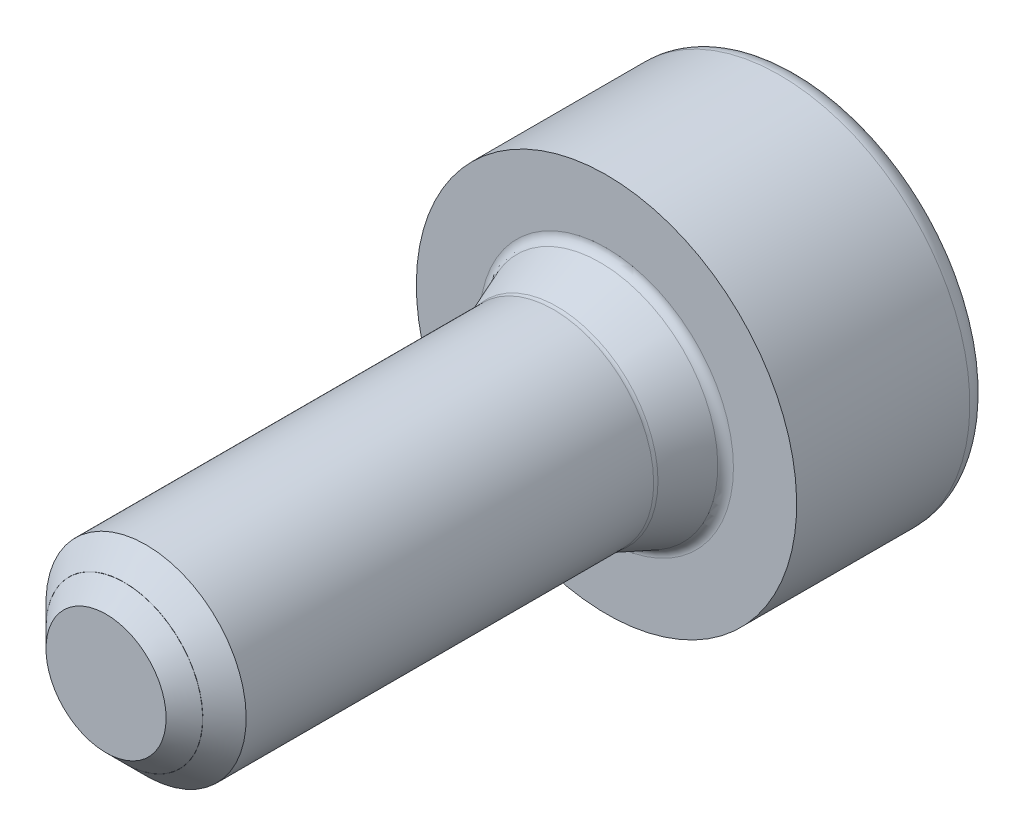
ISO-10303-21;
HEADER;
FILE_DESCRIPTION(('STEP AP214'),'2;1');
FILE_NAME('part.step','',(''),(''),'','','');
FILE_SCHEMA(('AUTOMOTIVE_DESIGN { 1 0 10303 214 1 1 1 1 }'));
ENDSEC;
DATA;
#1=APPLICATION_CONTEXT('core data for automotive mechanical design processes');
#2=APPLICATION_PROTOCOL_DEFINITION('international standard','automotive_design',2000,#1);
#3=PRODUCT_CONTEXT('',#1,'mechanical');
#4=PRODUCT('Part','Part','',(#3));
#5=PRODUCT_RELATED_PRODUCT_CATEGORY('part','',(#4));
#6=PRODUCT_DEFINITION_FORMATION('','',#4);
#7=PRODUCT_DEFINITION_CONTEXT('part definition',#1,'design');
#8=PRODUCT_DEFINITION('design','',#6,#7);
#9=PRODUCT_DEFINITION_SHAPE('','',#8);
#10=(LENGTH_UNIT() NAMED_UNIT(*) SI_UNIT(.MILLI.,.METRE.));
#11=(NAMED_UNIT(*) PLANE_ANGLE_UNIT() SI_UNIT($,.RADIAN.));
#12=(NAMED_UNIT(*) SI_UNIT($,.STERADIAN.) SOLID_ANGLE_UNIT());
#13=UNCERTAINTY_MEASURE_WITH_UNIT(LENGTH_MEASURE(1.E-05),#10,'distance_accuracy_value','');
#14=(GEOMETRIC_REPRESENTATION_CONTEXT(3) GLOBAL_UNCERTAINTY_ASSIGNED_CONTEXT((#13)) GLOBAL_UNIT_ASSIGNED_CONTEXT((#10,
#11,#12)) REPRESENTATION_CONTEXT('',''));
#15=CARTESIAN_POINT('',(0.,0.,0.));
#16=DIRECTION('',(0.,0.,1.));
#17=DIRECTION('',(1.,0.,0.));
#18=AXIS2_PLACEMENT_3D('',#15,#16,#17);
#19=CARTESIAN_POINT('',(-5.5,8.176279441629,11.78794470637));
#20=DIRECTION('',(0.,0.,-1.));
#21=DIRECTION('',(0.500000000000017,-0.866025403784429,0.));
#22=AXIS2_PLACEMENT_3D('',#19,#20,#21);
#23=CONICAL_SURFACE('',#22,1.091002075935,0.373726819965523);
#24=CARTESIAN_POINT('',(-5.5,8.176279441629,11.57349124712));
#25=DIRECTION('',(0.,0.,-1.));
#26=DIRECTION('',(0.500000000000017,-0.866025403784429,0.));
#27=AXIS2_PLACEMENT_3D('',#24,#25,#26);
#28=CIRCLE('',#27,1.175101471718);
#29=CARTESIAN_POINT('',(-4.91244926414098,7.15861171509674,11.57349124712));
#30=VERTEX_POINT('',#29);
#31=EDGE_CURVE('E32',#30,#30,#28,.T.);
#32=ORIENTED_EDGE('',*,*,#31,.F.);
#33=EDGE_LOOP('',(#32));
#34=FACE_BOUND('',#33,.T.);
#35=CARTESIAN_POINT('',(-5.5,8.176279441629,12.00239816561));
#36=DIRECTION('',(0.,0.,1.));
#37=DIRECTION('',(-0.500000000000017,0.866025403784429,0.));
#38=AXIS2_PLACEMENT_3D('',#35,#36,#37);
#39=CIRCLE('',#38,1.006902680151);
#40=CARTESIAN_POINT('',(-6.00345134007552,9.04828274177839,12.00239816561));
#41=VERTEX_POINT('',#40);
#42=EDGE_CURVE('E11',#41,#41,#39,.T.);
#43=ORIENTED_EDGE('',*,*,#42,.F.);
#44=EDGE_LOOP('',(#43));
#45=FACE_BOUND('',#44,.T.);
#46=ADVANCED_FACE('F16',(#34,#45),#23,.T.);
#47=CARTESIAN_POINT('',(-5.5,8.176279441629,12.0389069185));
#48=DIRECTION('',(0.,0.,-1.));
#49=DIRECTION('',(0.500000000000017,-0.866025403784429,0.));
#50=AXIS2_PLACEMENT_3D('',#47,#48,#49);
#51=TOROIDAL_SURFACE('',#50,1.1,0.1);
#52=CARTESIAN_POINT('',(-5.5,8.176279441629,12.0389069185));
#53=DIRECTION('',(0.,0.,-1.));
#54=DIRECTION('',(0.500000000000017,-0.866025403784429,0.));
#55=AXIS2_PLACEMENT_3D('',#52,#53,#54);
#56=CIRCLE('',#55,1.);
#57=CARTESIAN_POINT('',(-4.99999999999998,7.31025403784457,12.0389069185));
#58=VERTEX_POINT('',#57);
#59=EDGE_CURVE('E133',#58,#58,#56,.T.);
#60=ORIENTED_EDGE('',*,*,#59,.T.);
#61=EDGE_LOOP('',(#60));
#62=FACE_BOUND('',#61,.T.);
#63=ORIENTED_EDGE('',*,*,#42,.T.);
#64=EDGE_LOOP('',(#63));
#65=FACE_BOUND('',#64,.T.);
#66=ADVANCED_FACE('F278',(#62,#65),#51,.F.);
#67=CARTESIAN_POINT('',(-5.5,8.176279441629,11.61));
#68=DIRECTION('',(0.,0.,1.));
#69=DIRECTION('',(-0.500000000000017,0.866025403784429,0.));
#70=AXIS2_PLACEMENT_3D('',#67,#68,#69);
#71=TOROIDAL_SURFACE('',#70,1.268198791567,0.1);
#72=CARTESIAN_POINT('',(-5.5,8.176279441629,11.51));
#73=DIRECTION('',(0.,0.,-1.));
#74=DIRECTION('',(-0.500000000000017,0.866025403784429,0.));
#75=AXIS2_PLACEMENT_3D('',#72,#73,#74);
#76=CIRCLE('',#75,1.268198791567);
#77=CARTESIAN_POINT('',(-6.13409939578352,9.27457181217474,11.51));
#78=VERTEX_POINT('',#77);
#79=EDGE_CURVE('E160',#78,#78,#76,.T.);
#80=ORIENTED_EDGE('',*,*,#79,.F.);
#81=EDGE_LOOP('',(#80));
#82=FACE_BOUND('',#81,.T.);
#83=ORIENTED_EDGE('',*,*,#31,.T.);
#84=EDGE_LOOP('',(#83));
#85=FACE_BOUND('',#84,.T.);
#86=ADVANCED_FACE('F283',(#82,#85),#71,.F.);
#87=CARTESIAN_POINT('',(-5.5,8.176279441629,11.51));
#88=DIRECTION('',(0.,0.,1.));
#89=DIRECTION('',(1.,0.,0.));
#90=AXIS2_PLACEMENT_3D('',#87,#88,#89);
#91=PLANE('',#90);
#92=CARTESIAN_POINT('',(-5.5,8.176279441629,11.51));
#93=DIRECTION('',(0.,0.,1.));
#94=DIRECTION('',(-0.500000000000017,0.866025403784429,0.));
#95=AXIS2_PLACEMENT_3D('',#92,#93,#94);
#96=CIRCLE('',#95,1.9);
#97=CARTESIAN_POINT('',(-6.45000000000003,9.82172770881941,11.51));
#98=VERTEX_POINT('',#97);
#99=EDGE_CURVE('E155',#98,#98,#96,.T.);
#100=ORIENTED_EDGE('',*,*,#99,.T.);
#101=EDGE_LOOP('',(#100));
#102=FACE_BOUND('',#101,.T.);
#103=ORIENTED_EDGE('',*,*,#79,.T.);
#104=EDGE_LOOP('',(#103));
#105=FACE_BOUND('',#104,.T.);
#106=ADVANCED_FACE('F290',(#102,#105),#91,.T.);
#107=CARTESIAN_POINT('',(-5.5,8.176279441629,9.58));
#108=DIRECTION('',(0.,0.,1.));
#109=DIRECTION('',(-0.500000000000017,0.866025403784429,0.));
#110=AXIS2_PLACEMENT_3D('',#107,#108,#109);
#111=CYLINDRICAL_SURFACE('',#110,1.9);
#112=ORIENTED_EDGE('',*,*,#99,.F.);
#113=EDGE_LOOP('',(#112));
#114=FACE_BOUND('',#113,.T.);
#115=CARTESIAN_POINT('',(-5.5,8.176279441629,9.78));
#116=DIRECTION('',(0.,0.,-1.));
#117=DIRECTION('',(-0.500000000000017,0.866025403784429,0.));
#118=AXIS2_PLACEMENT_3D('',#115,#116,#117);
#119=CIRCLE('',#118,1.9);
#120=CARTESIAN_POINT('',(-6.45000000000003,9.82172770881941,9.78));
#121=VERTEX_POINT('',#120);
#122=EDGE_CURVE('E151',#121,#121,#119,.T.);
#123=ORIENTED_EDGE('',*,*,#122,.F.);
#124=EDGE_LOOP('',(#123));
#125=FACE_BOUND('',#124,.T.);
#126=ADVANCED_FACE('F296',(#114,#125),#111,.T.);
#127=CARTESIAN_POINT('',(-5.5,8.176279441629,9.78));
#128=DIRECTION('',(0.,0.,-1.));
#129=DIRECTION('',(0.500000000000017,-0.866025403784429,0.));
#130=AXIS2_PLACEMENT_3D('',#127,#128,#129);
#131=TOROIDAL_SURFACE('',#130,1.7,0.2);
#132=CARTESIAN_POINT('',(-5.5,8.176279441629,9.58));
#133=DIRECTION('',(0.,0.,-1.));
#134=DIRECTION('',(0.500000000000017,-0.866025403784429,0.));
#135=AXIS2_PLACEMENT_3D('',#132,#133,#134);
#136=CIRCLE('',#135,1.7);
#137=CARTESIAN_POINT('',(-4.64999999999997,6.70403625519547,9.58));
#138=VERTEX_POINT('',#137);
#139=EDGE_CURVE('E156',#138,#138,#136,.T.);
#140=ORIENTED_EDGE('',*,*,#139,.F.);
#141=EDGE_LOOP('',(#140));
#142=FACE_BOUND('',#141,.T.);
#143=ORIENTED_EDGE('',*,*,#122,.T.);
#144=EDGE_LOOP('',(#143));
#145=FACE_BOUND('',#144,.T.);
#146=ADVANCED_FACE('F301',(#142,#145),#131,.T.);
#147=CARTESIAN_POINT('',(-5.5,8.176279441629,9.58));
#148=DIRECTION('',(0.,0.,-1.));
#149=DIRECTION('',(0.,-1.,0.));
#150=AXIS2_PLACEMENT_3D('',#147,#148,#149);
#151=PLANE('',#150);
#152=ORIENTED_EDGE('',*,*,#139,.T.);
#153=EDGE_LOOP('',(#152));
#154=FACE_BOUND('',#153,.T.);
#155=DIRECTION('',(-0.866025403784429,0.500000000000017,0.));
#156=VECTOR('',#155,1.);
#157=CARTESIAN_POINT('',(-4.75,8.609292143521,9.58));
#158=LINE('',#157,#156);
#159=CARTESIAN_POINT('',(-4.75,8.609292143521,9.58));
#160=VERTEX_POINT('',#159);
#161=CARTESIAN_POINT('',(-5.5,9.042304845413,9.58));
#162=VERTEX_POINT('',#161);
#163=EDGE_CURVE('E173',#160,#162,#158,.T.);
#164=ORIENTED_EDGE('',*,*,#163,.T.);
#165=DIRECTION('',(0.866025403784429,0.500000000000017,0.));
#166=VECTOR('',#165,1.);
#167=CARTESIAN_POINT('',(-6.25,8.609292143521,9.58));
#168=LINE('',#167,#166);
#169=CARTESIAN_POINT('',(-6.25,8.609292143521,9.58));
#170=VERTEX_POINT('',#169);
#171=EDGE_CURVE('E116',#170,#162,#168,.T.);
#172=ORIENTED_EDGE('',*,*,#171,.F.);
#173=DIRECTION('',(0.,-1.,0.));
#174=VECTOR('',#173,1.);
#175=CARTESIAN_POINT('',(-6.25,8.609292143521,9.58));
#176=LINE('',#175,#174);
#177=CARTESIAN_POINT('',(-6.25,7.743266739737,9.58));
#178=VERTEX_POINT('',#177);
#179=EDGE_CURVE('E112',#170,#178,#176,.T.);
#180=ORIENTED_EDGE('',*,*,#179,.T.);
#181=DIRECTION('',(0.866025403784429,-0.500000000000017,0.));
#182=VECTOR('',#181,1.);
#183=CARTESIAN_POINT('',(-6.25,7.743266739737,9.58));
#184=LINE('',#183,#182);
#185=CARTESIAN_POINT('',(-5.5,7.310254037844,9.58));
#186=VERTEX_POINT('',#185);
#187=EDGE_CURVE('E169',#178,#186,#184,.T.);
#188=ORIENTED_EDGE('',*,*,#187,.T.);
#189=DIRECTION('',(-0.866025403784429,-0.500000000000017,0.));
#190=VECTOR('',#189,1.);
#191=CARTESIAN_POINT('',(-4.75,7.743266739737,9.58));
#192=LINE('',#191,#190);
#193=CARTESIAN_POINT('',(-4.75,7.743266739737,9.58));
#194=VERTEX_POINT('',#193);
#195=EDGE_CURVE('E164',#194,#186,#192,.T.);
#196=ORIENTED_EDGE('',*,*,#195,.F.);
#197=DIRECTION('',(0.,1.,0.));
#198=VECTOR('',#197,1.);
#199=CARTESIAN_POINT('',(-4.75,7.743266739737,9.58));
#200=LINE('',#199,#198);
#201=EDGE_CURVE('E46',#194,#160,#200,.T.);
#202=ORIENTED_EDGE('',*,*,#201,.T.);
#203=EDGE_LOOP('',(#164,#172,#180,#188,#196,#202));
#204=FACE_BOUND('',#203,.T.);
#205=ADVANCED_FACE('F304',(#154,#204),#151,.T.);
#206=CARTESIAN_POINT('',(-4.75,8.176279441629,10.33));
#207=DIRECTION('',(1.,0.,0.));
#208=DIRECTION('',(0.,1.,0.));
#209=AXIS2_PLACEMENT_3D('',#206,#207,#208);
#210=PLANE('',#209);
#211=ORIENTED_EDGE('',*,*,#201,.F.);
#212=DIRECTION('',(0.,0.,-1.));
#213=VECTOR('',#212,1.);
#214=CARTESIAN_POINT('',(-4.75,7.743266739737,10.57998533269));
#215=LINE('',#214,#213);
#216=CARTESIAN_POINT('',(-4.75000000000012,7.74326673973699,10.5799853326872));
#217=VERTEX_POINT('',#216);
#218=EDGE_CURVE('E172',#217,#194,#215,.T.);
#219=ORIENTED_EDGE('',*,*,#218,.F.);
#220=CARTESIAN_POINT('',(-4.75,8.60929214352109,10.5799853326871));
#221=CARTESIAN_POINT('',(-4.75,8.57123547365222,10.5909748550173));
#222=CARTESIAN_POINT('',(-4.75,8.53285027963346,10.6009692526385));
#223=CARTESIAN_POINT('',(-4.75,8.45541523688286,10.6184141692236));
#224=CARTESIAN_POINT('',(-4.75,8.41636401254825,10.6258585170532));
#225=CARTESIAN_POINT('',(-4.75,8.3387455349859,10.6374461530633));
#226=CARTESIAN_POINT('',(-4.75,8.30019022242791,10.6416665775635));
#227=CARTESIAN_POINT('',(-4.75,8.22289826861885,10.6467039041215));
#228=CARTESIAN_POINT('',(-4.75,8.18416190814528,10.647524978911));
#229=CARTESIAN_POINT('',(-4.75,8.11178742223541,10.6458123276901));
#230=CARTESIAN_POINT('',(-4.75,8.07813843465588,10.6436991136606));
#231=CARTESIAN_POINT('',(-4.75,8.01105968520212,10.6370028771495));
#232=CARTESIAN_POINT('',(-4.75,7.97763015519125,10.6324175693746));
#233=CARTESIAN_POINT('',(-4.75,7.91041321187103,10.6209552091911));
#234=CARTESIAN_POINT('',(-4.75,7.87663430240448,10.6140295891455));
#235=CARTESIAN_POINT('',(-4.75,7.80958017696282,10.598311379411));
#236=CARTESIAN_POINT('',(-4.75,7.77630410251068,10.5895224807054));
#237=CARTESIAN_POINT('',(-4.75,7.74326673973728,10.5799853326872));
#238=B_SPLINE_CURVE_WITH_KNOTS('',3,(#220,#221,#222,#223,#224,#225,#226,#227,#228,#229,#230,
#231,#232,#233,#234,#235,#236,#237),.UNSPECIFIED.,.F.,.F.,(4,2,2,2,2,2,2,2,4),(0.,
0.118881584152532,0.238048862866214,0.35426694559993,0.470342327239906,0.571392045660872,
0.672535338686621,0.775921626428105,0.879104997726763),.UNSPECIFIED.);
#239=CARTESIAN_POINT('',(-4.75,8.60929214352105,10.5799853326871));
#240=VERTEX_POINT('',#239);
#241=EDGE_CURVE('E317',#240,#217,#238,.T.);
#242=ORIENTED_EDGE('',*,*,#241,.F.);
#243=DIRECTION('',(0.,0.,-1.));
#244=VECTOR('',#243,1.);
#245=CARTESIAN_POINT('',(-4.75,8.609292143521,10.57998533269));
#246=LINE('',#245,#244);
#247=EDGE_CURVE('E163',#240,#160,#246,.T.);
#248=ORIENTED_EDGE('',*,*,#247,.T.);
#249=EDGE_LOOP('',(#211,#219,#242,#248));
#250=FACE_BOUND('',#249,.T.);
#251=ADVANCED_FACE('F308',(#250),#210,.F.);
#252=CARTESIAN_POINT('',(-5.125,8.825798494467,10.33));
#253=DIRECTION('',(0.500000000000017,0.866025403784429,0.));
#254=DIRECTION('',(0.,0.,-1.));
#255=AXIS2_PLACEMENT_3D('',#252,#253,#254);
#256=PLANE('',#255);
#257=ORIENTED_EDGE('',*,*,#163,.F.);
#258=ORIENTED_EDGE('',*,*,#247,.F.);
#259=CARTESIAN_POINT('',(-5.5000000000001,9.04230484541318,10.5799853326872));
#260=CARTESIAN_POINT('',(-5.46704195711023,9.02327651047875,10.5909748550174));
#261=CARTESIAN_POINT('',(-5.4337994039608,9.00408391346937,10.6009692526387));
#262=CARTESIAN_POINT('',(-5.36673868979567,8.96536639209408,10.6184141692238));
#263=CARTESIAN_POINT('',(-5.33291933747302,8.94584077992678,10.6258585170533));
#264=CARTESIAN_POINT('',(-5.26569976410097,8.90703154114561,10.6374461530634));
#265=CARTESIAN_POINT('',(-5.2323098839749,8.88775388486662,10.6416665775636));
#266=CARTESIAN_POINT('',(-5.16537308846815,8.8491079079621,10.6467039041216));
#267=CARTESIAN_POINT('',(-5.13182641624789,8.82973972772532,10.6475249789111));
#268=CARTESIAN_POINT('',(-5.06914827286408,8.79355248477037,10.6458123276903));
#269=CARTESIAN_POINT('',(-5.04000739480855,8.77672799098058,10.6436991136608));
#270=CARTESIAN_POINT('',(-4.98191549372744,8.74318861625367,10.6370028771497));
#271=CARTESIAN_POINT('',(-4.95296467150142,8.72647385124822,10.6324175693748));
#272=CARTESIAN_POINT('',(-4.89475309102131,8.69286537958807,10.6209552091913));
#273=CARTESIAN_POINT('',(-4.8654996973111,8.67597592485477,10.6140295891456));
#274=CARTESIAN_POINT('',(-4.80742912125001,8.6424488621339,10.5983113794111));
#275=CARTESIAN_POINT('',(-4.77861119543621,8.62581082490781,10.5895224807055));
#276=CARTESIAN_POINT('',(-4.75000000000037,8.60929214352109,10.5799853326873));
#277=B_SPLINE_CURVE_WITH_KNOTS('',3,(#259,#260,#261,#262,#263,#264,#265,#266,#267,#268,#269,
#270,#271,#272,#273,#274,#275,#276),.UNSPECIFIED.,.F.,.F.,(4,2,2,2,2,2,2,2,4),(0.,
0.118881584152504,0.238048862866161,0.35426694559985,0.470342327239796,0.571392045660871,
0.672535338686734,0.775921626428339,0.879104997727117),.UNSPECIFIED.);
#278=CARTESIAN_POINT('',(-5.50000000000005,9.04230484541309,10.5799853326873));
#279=VERTEX_POINT('',#278);
#280=EDGE_CURVE('E127',#279,#240,#277,.T.);
#281=ORIENTED_EDGE('',*,*,#280,.F.);
#282=DIRECTION('',(0.,0.,-1.));
#283=VECTOR('',#282,1.);
#284=CARTESIAN_POINT('',(-5.5,9.042304845413,10.57998533269));
#285=LINE('',#284,#283);
#286=EDGE_CURVE('E122',#279,#162,#285,.T.);
#287=ORIENTED_EDGE('',*,*,#286,.T.);
#288=EDGE_LOOP('',(#257,#258,#281,#287));
#289=FACE_BOUND('',#288,.T.);
#290=ADVANCED_FACE('F313',(#289),#256,.F.);
#291=CARTESIAN_POINT('',(-5.875,8.825798494467,10.33));
#292=DIRECTION('',(-0.500000000000017,0.866025403784429,0.));
#293=DIRECTION('',(0.,0.,1.));
#294=AXIS2_PLACEMENT_3D('',#291,#292,#293);
#295=PLANE('',#294);
#296=ORIENTED_EDGE('',*,*,#171,.T.);
#297=ORIENTED_EDGE('',*,*,#286,.F.);
#298=CARTESIAN_POINT('',(-6.25000000000008,8.60929214352083,10.5799853326872));
#299=CARTESIAN_POINT('',(-6.2170419571102,8.62832047845527,10.5909748550174));
#300=CARTESIAN_POINT('',(-6.18379940396076,8.64751307546465,10.6009692526386));
#301=CARTESIAN_POINT('',(-6.11673868979563,8.68623059683994,10.6184141692237));
#302=CARTESIAN_POINT('',(-6.08291933747297,8.70575620900724,10.6258585170533));
#303=CARTESIAN_POINT('',(-6.01569976410091,8.74456544778842,10.6374461530634));
#304=CARTESIAN_POINT('',(-5.98230988397485,8.76384310406741,10.6416665775636));
#305=CARTESIAN_POINT('',(-5.91537308846808,8.80248908097194,10.6467039041216));
#306=CARTESIAN_POINT('',(-5.88182641624782,8.82185726120872,10.6475249789111));
#307=CARTESIAN_POINT('',(-5.81914827286401,8.85804450416367,10.6458123276903));
#308=CARTESIAN_POINT('',(-5.79000739480848,8.87486899795345,10.6436991136608));
#309=CARTESIAN_POINT('',(-5.73191549372739,8.90840837268036,10.6370028771497));
#310=CARTESIAN_POINT('',(-5.70296467150138,8.92512313768581,10.6324175693749));
#311=CARTESIAN_POINT('',(-5.64475309102127,8.95873160934595,10.6209552091913));
#312=CARTESIAN_POINT('',(-5.61549969731108,8.97562106407925,10.6140295891457));
#313=CARTESIAN_POINT('',(-5.55742912124999,9.00914812680011,10.5983113794111));
#314=CARTESIAN_POINT('',(-5.5286111954362,9.02578616402619,10.5895224807056));
#315=CARTESIAN_POINT('',(-5.50000000000037,9.04230484541291,10.5799853326874));
#316=B_SPLINE_CURVE_WITH_KNOTS('',3,(#298,#299,#300,#301,#302,#303,#304,#305,#306,#307,#308,
#309,#310,#311,#312,#313,#314,#315),.UNSPECIFIED.,.F.,.F.,(4,2,2,2,2,2,2,2,4),(0.,
0.118881584152522,0.238048862866198,0.354266945599905,0.470342327239869,0.571392045660921,
0.672535338686759,0.775921626428338,0.879104997727092),.UNSPECIFIED.);
#317=CARTESIAN_POINT('',(-6.25000000000004,8.60929214352092,10.5799853326872));
#318=VERTEX_POINT('',#317);
#319=EDGE_CURVE('E119',#318,#279,#316,.T.);
#320=ORIENTED_EDGE('',*,*,#319,.F.);
#321=DIRECTION('',(0.,0.,-1.));
#322=VECTOR('',#321,1.);
#323=CARTESIAN_POINT('',(-6.25,8.609292143521,10.57998533269));
#324=LINE('',#323,#322);
#325=EDGE_CURVE('E108',#318,#170,#324,.T.);
#326=ORIENTED_EDGE('',*,*,#325,.T.);
#327=EDGE_LOOP('',(#296,#297,#320,#326));
#328=FACE_BOUND('',#327,.T.);
#329=ADVANCED_FACE('F120',(#328),#295,.F.);
#330=CARTESIAN_POINT('',(-6.25,8.176279441629,10.33));
#331=DIRECTION('',(-1.,0.,0.));
#332=DIRECTION('',(0.,0.,1.));
#333=AXIS2_PLACEMENT_3D('',#330,#331,#332);
#334=PLANE('',#333);
#335=ORIENTED_EDGE('',*,*,#179,.F.);
#336=ORIENTED_EDGE('',*,*,#325,.F.);
#337=CARTESIAN_POINT('',(-6.25,7.74326673973691,10.5799853326871));
#338=CARTESIAN_POINT('',(-6.25,7.78132340960578,10.5909748550173));
#339=CARTESIAN_POINT('',(-6.25,7.81970860362455,10.6009692526385));
#340=CARTESIAN_POINT('',(-6.25,7.89714364637514,10.6184141692236));
#341=CARTESIAN_POINT('',(-6.25,7.93619487070975,10.6258585170532));
#342=CARTESIAN_POINT('',(-6.25,8.0138133482721,10.6374461530633));
#343=CARTESIAN_POINT('',(-6.25,8.05236866083009,10.6416665775635));
#344=CARTESIAN_POINT('',(-6.25,8.12966061463915,10.6467039041215));
#345=CARTESIAN_POINT('',(-6.25,8.16839697511272,10.647524978911));
#346=CARTESIAN_POINT('',(-6.25,8.24077146102259,10.6458123276901));
#347=CARTESIAN_POINT('',(-6.25,8.27442044860211,10.6436991136606));
#348=CARTESIAN_POINT('',(-6.25,8.34149919805584,10.6370028771495));
#349=CARTESIAN_POINT('',(-6.25,8.3749287280667,10.6324175693747));
#350=CARTESIAN_POINT('',(-6.25,8.44214567138691,10.6209552091911));
#351=CARTESIAN_POINT('',(-6.25,8.47592458085345,10.6140295891455));
#352=CARTESIAN_POINT('',(-6.25,8.5429787062951,10.598311379411));
#353=CARTESIAN_POINT('',(-6.25,8.57625478074722,10.5895224807054));
#354=CARTESIAN_POINT('',(-6.25,8.60929214352061,10.5799853326873));
#355=B_SPLINE_CURVE_WITH_KNOTS('',3,(#337,#338,#339,#340,#341,#342,#343,#344,#345,#346,#347,
#348,#349,#350,#351,#352,#353,#354),.UNSPECIFIED.,.F.,.F.,(4,2,2,2,2,2,2,2,4),(0.,
0.118881584152532,0.238048862866214,0.354266945599928,0.470342327239907,0.571392045660846,
0.672535338686568,0.775921626428025,0.879104997726655),.UNSPECIFIED.);
#356=CARTESIAN_POINT('',(-6.24999999999982,7.74326673973695,10.5799853326872));
#357=VERTEX_POINT('',#356);
#358=EDGE_CURVE('E19',#357,#318,#355,.T.);
#359=ORIENTED_EDGE('',*,*,#358,.F.);
#360=DIRECTION('',(0.,0.,-1.));
#361=VECTOR('',#360,1.);
#362=CARTESIAN_POINT('',(-6.25,7.743266739737,10.57998533269));
#363=LINE('',#362,#361);
#364=EDGE_CURVE('E100',#357,#178,#363,.T.);
#365=ORIENTED_EDGE('',*,*,#364,.T.);
#366=EDGE_LOOP('',(#335,#336,#359,#365));
#367=FACE_BOUND('',#366,.T.);
#368=ADVANCED_FACE('F110',(#367),#334,.F.);
#369=CARTESIAN_POINT('',(-5.875,7.526760388791,10.33));
#370=DIRECTION('',(-0.500000000000017,-0.866025403784429,0.));
#371=DIRECTION('',(-0.866025403784429,0.500000000000017,0.));
#372=AXIS2_PLACEMENT_3D('',#369,#370,#371);
#373=PLANE('',#372);
#374=ORIENTED_EDGE('',*,*,#187,.F.);
#375=ORIENTED_EDGE('',*,*,#364,.F.);
#376=CARTESIAN_POINT('',(-5.49999999999972,7.31025403784472,10.5799853326872));
#377=CARTESIAN_POINT('',(-5.53295804288959,7.32928237277915,10.5909748550174));
#378=CARTESIAN_POINT('',(-5.56620059603903,7.34847496978853,10.6009692526386));
#379=CARTESIAN_POINT('',(-5.63326131020417,7.38719249116382,10.6184141692237));
#380=CARTESIAN_POINT('',(-5.66708066252682,7.40671810333113,10.6258585170533));
#381=CARTESIAN_POINT('',(-5.73430023589888,7.4455273421123,10.6374461530634));
#382=CARTESIAN_POINT('',(-5.76769011602494,7.46480499839129,10.6416665775636));
#383=CARTESIAN_POINT('',(-5.83462691153171,7.50345097529581,10.6467039041216));
#384=CARTESIAN_POINT('',(-5.86817358375197,7.5228191555326,10.6475249789111));
#385=CARTESIAN_POINT('',(-5.93085172713579,7.55900639848756,10.6458123276903));
#386=CARTESIAN_POINT('',(-5.95999260519134,7.57583089227735,10.6436991136608));
#387=CARTESIAN_POINT('',(-6.01808450627247,7.60937026700428,10.6370028771497));
#388=CARTESIAN_POINT('',(-6.0470353284985,7.62608503200974,10.6324175693748));
#389=CARTESIAN_POINT('',(-6.10524690897864,7.6596935036699,10.6209552091913));
#390=CARTESIAN_POINT('',(-6.13450030268885,7.6765829584032,10.6140295891456));
#391=CARTESIAN_POINT('',(-6.19257087874997,7.71011002112409,10.5983113794111));
#392=CARTESIAN_POINT('',(-6.22138880456378,7.72674805835018,10.5895224807055));
#393=CARTESIAN_POINT('',(-6.24999999999963,7.74326673973691,10.5799853326873));
#394=B_SPLINE_CURVE_WITH_KNOTS('',3,(#376,#377,#378,#379,#380,#381,#382,#383,#384,#385,#386,
#387,#388,#389,#390,#391,#392,#393),.UNSPECIFIED.,.F.,.F.,(4,2,2,2,2,2,2,2,4),(0.,
0.118881584152518,0.23804886286619,0.354266945599892,0.470342327239851,0.571392045660967,
0.672535338686867,0.775921626428514,0.879104997727332),.UNSPECIFIED.);
#395=CARTESIAN_POINT('',(-5.49999999999986,7.31025403784436,10.579985332687));
#396=VERTEX_POINT('',#395);
#397=EDGE_CURVE('E131',#396,#357,#394,.T.);
#398=ORIENTED_EDGE('',*,*,#397,.F.);
#399=DIRECTION('',(0.,0.,-1.));
#400=VECTOR('',#399,1.);
#401=CARTESIAN_POINT('',(-5.5,7.310254037844,10.57998533269));
#402=LINE('',#401,#400);
#403=EDGE_CURVE('E168',#396,#186,#402,.T.);
#404=ORIENTED_EDGE('',*,*,#403,.T.);
#405=EDGE_LOOP('',(#374,#375,#398,#404));
#406=FACE_BOUND('',#405,.T.);
#407=ADVANCED_FACE('F351',(#406),#373,.F.);
#408=CARTESIAN_POINT('',(-5.125,7.526760388791,10.33));
#409=DIRECTION('',(0.500000000000017,-0.866025403784429,0.));
#410=DIRECTION('',(0.,0.,-1.));
#411=AXIS2_PLACEMENT_3D('',#408,#409,#410);
#412=PLANE('',#411);
#413=ORIENTED_EDGE('',*,*,#195,.T.);
#414=ORIENTED_EDGE('',*,*,#403,.F.);
#415=CARTESIAN_POINT('',(-4.75000000000024,7.74326673973698,10.5799853326873));
#416=CARTESIAN_POINT('',(-4.78295804289011,7.72423840480255,10.5909748550174));
#417=CARTESIAN_POINT('',(-4.81620059603955,7.70504580779317,10.6009692526387));
#418=CARTESIAN_POINT('',(-4.88326131020467,7.66632828641789,10.6184141692238));
#419=CARTESIAN_POINT('',(-4.91708066252732,7.64680267425059,10.6258585170534));
#420=CARTESIAN_POINT('',(-4.98430023589937,7.60799343546942,10.6374461530634));
#421=CARTESIAN_POINT('',(-5.01769011602543,7.58871577919043,10.6416665775636));
#422=CARTESIAN_POINT('',(-5.08462691153218,7.55006980228591,10.6467039041216));
#423=CARTESIAN_POINT('',(-5.11817358375244,7.53070162204913,10.6475249789111));
#424=CARTESIAN_POINT('',(-5.18085172713626,7.49451437909417,10.6458123276903));
#425=CARTESIAN_POINT('',(-5.2099926051918,7.47768988530438,10.6436991136608));
#426=CARTESIAN_POINT('',(-5.26808450627293,7.44415051057745,10.6370028771496));
#427=CARTESIAN_POINT('',(-5.29703532849896,7.42743574557199,10.6324175693748));
#428=CARTESIAN_POINT('',(-5.3552469089791,7.39382727391183,10.6209552091912));
#429=CARTESIAN_POINT('',(-5.38450030268931,7.37693781917853,10.6140295891456));
#430=CARTESIAN_POINT('',(-5.44257087875043,7.34341075645765,10.598311379411));
#431=CARTESIAN_POINT('',(-5.47138880456424,7.32677271923155,10.5895224807054));
#432=CARTESIAN_POINT('',(-5.50000000000009,7.31025403784483,10.5799853326873));
#433=B_SPLINE_CURVE_WITH_KNOTS('',3,(#415,#416,#417,#418,#419,#420,#421,#422,#423,#424,#425,
#426,#427,#428,#429,#430,#431,#432),.UNSPECIFIED.,.F.,.F.,(4,2,2,2,2,2,2,2,4),(0.,
0.118881584152497,0.238048862866148,0.354266945599831,0.470342327239771,0.571392045660887,
0.672535338686788,0.775921626428436,0.879104997727254),.UNSPECIFIED.);
#434=EDGE_CURVE('E325',#217,#396,#433,.T.);
#435=ORIENTED_EDGE('',*,*,#434,.F.);
#436=ORIENTED_EDGE('',*,*,#218,.T.);
#437=EDGE_LOOP('',(#413,#414,#435,#436));
#438=FACE_BOUND('',#437,.T.);
#439=ADVANCED_FACE('F339',(#438),#412,.F.);
#440=CARTESIAN_POINT('',(-5.5,8.176279441629,10.82499251967));
#441=DIRECTION('',(0.,0.,-1.));
#442=DIRECTION('',(0.500000000000017,-0.866025403784429,0.));
#443=AXIS2_PLACEMENT_3D('',#440,#441,#442);
#444=CONICAL_SURFACE('',#443,0.4416729559301,1.04718484902488);
#445=ORIENTED_EDGE('',*,*,#358,.T.);
#446=ORIENTED_EDGE('',*,*,#319,.T.);
#447=ORIENTED_EDGE('',*,*,#280,.T.);
#448=ORIENTED_EDGE('',*,*,#241,.T.);
#449=ORIENTED_EDGE('',*,*,#434,.T.);
#450=ORIENTED_EDGE('',*,*,#397,.T.);
#451=EDGE_LOOP('',(#445,#446,#447,#448,#449,#450));
#452=FACE_BOUND('',#451,.T.);
#453=CARTESIAN_POINT('',(-5.5,8.176279441629,11.08));
#454=VERTEX_POINT('',#453);
#455=VERTEX_LOOP('',#454);
#456=FACE_BOUND('',#455,.T.);
#457=ADVANCED_FACE('F128',(#452,#456),#444,.F.);
#458=CARTESIAN_POINT('',(-5.5,8.176279441629,11.51));
#459=DIRECTION('',(0.,0.,1.));
#460=DIRECTION('',(-0.500000000000017,0.866025403784429,0.));
#461=AXIS2_PLACEMENT_3D('',#458,#459,#460);
#462=CYLINDRICAL_SURFACE('',#461,1.);
#463=CARTESIAN_POINT('',(-5.5,8.176279441629,16.11));
#464=DIRECTION('',(0.,0.,1.));
#465=DIRECTION('',(0.500000000000017,-0.866025403784429,0.));
#466=AXIS2_PLACEMENT_3D('',#463,#464,#465);
#467=CIRCLE('',#466,1.);
#468=CARTESIAN_POINT('',(-4.99999999999998,7.31025403784457,16.11));
#469=VERTEX_POINT('',#468);
#470=EDGE_CURVE('E139',#469,#469,#467,.T.);
#471=ORIENTED_EDGE('',*,*,#470,.F.);
#472=EDGE_LOOP('',(#471));
#473=FACE_BOUND('',#472,.T.);
#474=ORIENTED_EDGE('',*,*,#59,.F.);
#475=EDGE_LOOP('',(#474));
#476=FACE_BOUND('',#475,.T.);
#477=ADVANCED_FACE('F338',(#473,#476),#462,.T.);
#478=CARTESIAN_POINT('',(-5.5,8.176279441629,16.2182531754));
#479=DIRECTION('',(0.,0.,-1.));
#480=DIRECTION('',(0.500000000000017,-0.866025403784429,0.));
#481=AXIS2_PLACEMENT_3D('',#478,#479,#480);
#482=CONICAL_SURFACE('',#481,0.8917468246,0.785398163397448);
#483=ORIENTED_EDGE('',*,*,#470,.T.);
#484=EDGE_LOOP('',(#483));
#485=FACE_BOUND('',#484,.T.);
#486=CARTESIAN_POINT('',(-5.5,8.176279441629,16.3265063508));
#487=DIRECTION('',(0.,0.,-1.));
#488=DIRECTION('',(0.500000000000017,-0.866025403784429,0.));
#489=AXIS2_PLACEMENT_3D('',#486,#487,#488);
#490=CIRCLE('',#489,0.7834936492);
#491=CARTESIAN_POINT('',(-5.10825317539999,7.49775403771804,16.3265063508));
#492=VERTEX_POINT('',#491);
#493=EDGE_CURVE('E147',#492,#492,#490,.T.);
#494=ORIENTED_EDGE('',*,*,#493,.T.);
#495=EDGE_LOOP('',(#494));
#496=FACE_BOUND('',#495,.T.);
#497=ADVANCED_FACE('F221',(#485,#496),#482,.T.);
#498=CARTESIAN_POINT('',(-5.5,8.176279441629,12.71));
#499=DIRECTION('',(0.,0.,1.));
#500=DIRECTION('',(-0.500000000000017,0.866025403784429,0.));
#501=AXIS2_PLACEMENT_3D('',#498,#499,#500);
#502=CYLINDRICAL_SURFACE('',#501,0.7834936492);
#503=ORIENTED_EDGE('',*,*,#493,.F.);
#504=EDGE_LOOP('',(#503));
#505=FACE_BOUND('',#504,.T.);
#506=CARTESIAN_POINT('',(-5.5,8.176279441629,12.71));
#507=DIRECTION('',(0.,0.,1.));
#508=DIRECTION('',(-0.500000000000017,0.866025403784429,0.));
#509=AXIS2_PLACEMENT_3D('',#506,#507,#508);
#510=CIRCLE('',#509,0.7834936492);
#511=CARTESIAN_POINT('',(-5.89174682460001,8.85480484553997,12.71));
#512=VERTEX_POINT('',#511);
#513=EDGE_CURVE('E632',#512,#512,#510,.T.);
#514=ORIENTED_EDGE('',*,*,#513,.F.);
#515=EDGE_LOOP('',(#514));
#516=FACE_BOUND('',#515,.T.);
#517=ADVANCED_FACE('F220',(#505,#516),#502,.F.);
#518=CARTESIAN_POINT('',(-5.5,8.176279441629,12.31006534829));
#519=DIRECTION('',(0.,0.,-1.));
#520=DIRECTION('',(0.500000000000017,-0.866025403784429,0.));
#521=AXIS2_PLACEMENT_3D('',#518,#519,#520);
#522=CONICAL_SURFACE('',#521,0.8912292208864,0.263136610985763);
#523=CARTESIAN_POINT('',(-5.5,8.176279441629,11.91022843931));
#524=DIRECTION('',(0.,0.,-1.));
#525=DIRECTION('',(0.499999999999761,-0.866025403784576,0.));
#526=AXIS2_PLACEMENT_3D('',#523,#524,#525);
#527=CIRCLE('',#526,0.998938462348202);
#528=CARTESIAN_POINT('',(-5.00078076892279,7.31160636928726,11.910228440025));
#529=VERTEX_POINT('',#528);
#530=CARTESIAN_POINT('',(-5.99921855292207,9.04095133937004,11.9102334749082));
#531=VERTEX_POINT('',#530);
#532=EDGE_CURVE('E202',#529,#531,#527,.T.);
#533=ORIENTED_EDGE('',*,*,#532,.T.);
#534=CARTESIAN_POINT('',(-5.5,8.176279441629,11.9099772835661));
#535=DIRECTION('',(0.,0.,-1.));
#536=DIRECTION('',(-0.500000000000422,0.866025403784195,0.));
#537=AXIS2_PLACEMENT_3D('',#534,#535,#536);
#538=CIRCLE('',#537,0.999006119420515);
#539=EDGE_CURVE('E236',#531,#529,#538,.T.);
#540=ORIENTED_EDGE('',*,*,#539,.T.);
#541=EDGE_LOOP('',(#533,#540));
#542=FACE_BOUND('',#541,.T.);
#543=ORIENTED_EDGE('',*,*,#513,.T.);
#544=EDGE_LOOP('',(#543));
#545=FACE_BOUND('',#544,.T.);
#546=ADVANCED_FACE('F209',(#542,#545),#522,.F.);
#547=CARTESIAN_POINT('',(-5.5,8.176279441629,12.3099397697));
#548=DIRECTION('',(0.,0.,-1.));
#549=DIRECTION('',(0.500000000000017,-0.866025403784429,0.));
#550=AXIS2_PLACEMENT_3D('',#547,#548,#549);
#551=CONICAL_SURFACE('',#550,0.8902630496152,0.263136610985763);
#552=ORIENTED_EDGE('',*,*,#539,.F.);
#553=ORIENTED_EDGE('',*,*,#532,.F.);
#554=EDGE_LOOP('',(#552,#553));
#555=FACE_BOUND('',#554,.T.);
#556=CARTESIAN_POINT('',(-5.5,8.176279441629,12.71));
#557=DIRECTION('',(0.,0.,-1.));
#558=DIRECTION('',(0.500000000000017,-0.866025403784429,0.));
#559=AXIS2_PLACEMENT_3D('',#556,#557,#558);
#560=CIRCLE('',#559,0.7824936492);
#561=CARTESIAN_POINT('',(-5.10875317539999,7.49862006312182,12.71));
#562=VERTEX_POINT('',#561);
#563=EDGE_CURVE('E639',#562,#562,#560,.T.);
#564=ORIENTED_EDGE('',*,*,#563,.T.);
#565=EDGE_LOOP('',(#564));
#566=FACE_BOUND('',#565,.T.);
#567=ADVANCED_FACE('F219',(#555,#566),#551,.T.);
#568=CARTESIAN_POINT('',(-5.5,8.176279441629,12.71));
#569=DIRECTION('',(0.,0.,1.));
#570=DIRECTION('',(-0.500000000000017,0.866025403784429,0.));
#571=AXIS2_PLACEMENT_3D('',#568,#569,#570);
#572=CYLINDRICAL_SURFACE('',#571,0.7824936492);
#573=CARTESIAN_POINT('',(-5.5,8.176279441629,16.3275063508));
#574=DIRECTION('',(0.,0.,1.));
#575=DIRECTION('',(-1.,0.,0.));
#576=AXIS2_PLACEMENT_3D('',#573,#574,#575);
#577=CIRCLE('',#576,0.7824936492);
#578=CARTESIAN_POINT('',(-6.2824936492,8.176279441629,16.3275063508));
#579=VERTEX_POINT('',#578);
#580=EDGE_CURVE('E643',#579,#579,#577,.T.);
#581=ORIENTED_EDGE('',*,*,#580,.F.);
#582=EDGE_LOOP('',(#581));
#583=FACE_BOUND('',#582,.T.);
#584=ORIENTED_EDGE('',*,*,#563,.F.);
#585=EDGE_LOOP('',(#584));
#586=FACE_BOUND('',#585,.T.);
#587=ADVANCED_FACE('F256',(#583,#586),#572,.T.);
#588=CARTESIAN_POINT('',(-5.5,8.176279441629,16.2182531754));
#589=DIRECTION('',(0.,0.,-1.));
#590=DIRECTION('',(0.500000000000017,-0.866025403784429,0.));
#591=AXIS2_PLACEMENT_3D('',#588,#589,#590);
#592=CONICAL_SURFACE('',#591,0.8917468246,0.785398163397448);
#593=ORIENTED_EDGE('',*,*,#580,.T.);
#594=EDGE_LOOP('',(#593));
#595=FACE_BOUND('',#594,.T.);
#596=CARTESIAN_POINT('',(-5.5,8.176279441629,16.51));
#597=DIRECTION('',(0.,0.,1.));
#598=DIRECTION('',(1.,0.,0.));
#599=AXIS2_PLACEMENT_3D('',#596,#597,#598);
#600=CIRCLE('',#599,0.6);
#601=CARTESIAN_POINT('',(-4.9,8.176279441629,16.51));
#602=VERTEX_POINT('',#601);
#603=EDGE_CURVE('E644',#602,#602,#600,.T.);
#604=ORIENTED_EDGE('',*,*,#603,.F.);
#605=EDGE_LOOP('',(#604));
#606=FACE_BOUND('',#605,.T.);
#607=ADVANCED_FACE('F259',(#595,#606),#592,.T.);
#608=CARTESIAN_POINT('',(-5.5,8.176279441629,16.51));
#609=DIRECTION('',(0.,0.,1.));
#610=DIRECTION('',(1.,0.,0.));
#611=AXIS2_PLACEMENT_3D('',#608,#609,#610);
#612=PLANE('',#611);
#613=ORIENTED_EDGE('',*,*,#603,.T.);
#614=EDGE_LOOP('',(#613));
#615=FACE_BOUND('',#614,.T.);
#616=ADVANCED_FACE('F257',(#615),#612,.T.);
#617=CLOSED_SHELL('',(#46,#66,#86,#106,#126,#146,#205,#251,#290,#329,#368,#407,#439,#457,#477,
#497,#517,#546,#567,#587,#607,#616));
#618=MANIFOLD_SOLID_BREP('B1',#617);
#619=ADVANCED_BREP_SHAPE_REPRESENTATION('',(#18,#618),#14);
#620=SHAPE_DEFINITION_REPRESENTATION(#9,#619);
ENDSEC;
END-ISO-10303-21;
